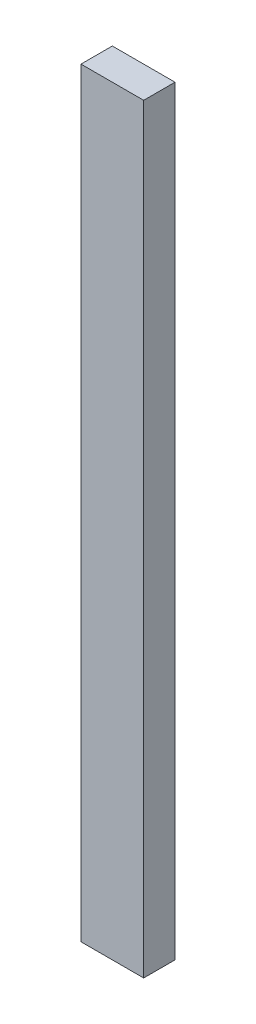
ISO-10303-21;
HEADER;
FILE_DESCRIPTION(('STEP AP214'),'2;1');
FILE_NAME('part.step','',(''),(''),'','','');
FILE_SCHEMA(('AUTOMOTIVE_DESIGN { 1 0 10303 214 1 1 1 1 }'));
ENDSEC;
DATA;
#1=APPLICATION_CONTEXT('core data for automotive mechanical design processes');
#2=APPLICATION_PROTOCOL_DEFINITION('international standard','automotive_design',2000,#1);
#3=PRODUCT_CONTEXT('',#1,'mechanical');
#4=PRODUCT('Part','Part','',(#3));
#5=PRODUCT_RELATED_PRODUCT_CATEGORY('part','',(#4));
#6=PRODUCT_DEFINITION_FORMATION('','',#4);
#7=PRODUCT_DEFINITION_CONTEXT('part definition',#1,'design');
#8=PRODUCT_DEFINITION('design','',#6,#7);
#9=PRODUCT_DEFINITION_SHAPE('','',#8);
#10=(LENGTH_UNIT() NAMED_UNIT(*) SI_UNIT(.MILLI.,.METRE.));
#11=(NAMED_UNIT(*) PLANE_ANGLE_UNIT() SI_UNIT($,.RADIAN.));
#12=(NAMED_UNIT(*) SI_UNIT($,.STERADIAN.) SOLID_ANGLE_UNIT());
#13=UNCERTAINTY_MEASURE_WITH_UNIT(LENGTH_MEASURE(1.E-05),#10,'distance_accuracy_value','');
#14=(GEOMETRIC_REPRESENTATION_CONTEXT(3) GLOBAL_UNCERTAINTY_ASSIGNED_CONTEXT((#13)) GLOBAL_UNIT_ASSIGNED_CONTEXT((#10,
#11,#12)) REPRESENTATION_CONTEXT('',''));
#15=CARTESIAN_POINT('',(0.,0.,0.));
#16=DIRECTION('',(0.,0.,1.));
#17=DIRECTION('',(1.,0.,0.));
#18=AXIS2_PLACEMENT_3D('',#15,#16,#17);
#19=CARTESIAN_POINT('',(24.,-291.,12.));
#20=DIRECTION('',(-1.,0.,0.));
#21=DIRECTION('',(0.,0.,1.));
#22=AXIS2_PLACEMENT_3D('',#19,#20,#21);
#23=PLANE('',#22);
#24=DIRECTION('',(0.,1.,0.));
#25=VECTOR('',#24,1.);
#26=CARTESIAN_POINT('',(24.,-291.,-12.));
#27=LINE('',#26,#25);
#28=CARTESIAN_POINT('',(24.,-291.,-12.));
#29=VERTEX_POINT('',#28);
#30=CARTESIAN_POINT('',(24.,291.,-12.));
#31=VERTEX_POINT('',#30);
#32=EDGE_CURVE('E114',#29,#31,#27,.T.);
#33=ORIENTED_EDGE('',*,*,#32,.T.);
#34=DIRECTION('',(0.,0.,-1.));
#35=VECTOR('',#34,1.);
#36=CARTESIAN_POINT('',(24.,291.,12.));
#37=LINE('',#36,#35);
#38=CARTESIAN_POINT('',(24.,291.,12.));
#39=VERTEX_POINT('',#38);
#40=EDGE_CURVE('E11',#39,#31,#37,.T.);
#41=ORIENTED_EDGE('',*,*,#40,.F.);
#42=DIRECTION('',(0.,1.,0.));
#43=VECTOR('',#42,1.);
#44=CARTESIAN_POINT('',(24.,-291.,12.));
#45=LINE('',#44,#43);
#46=CARTESIAN_POINT('',(24.,-291.,12.));
#47=VERTEX_POINT('',#46);
#48=EDGE_CURVE('E97',#47,#39,#45,.T.);
#49=ORIENTED_EDGE('',*,*,#48,.F.);
#50=DIRECTION('',(0.,0.,-1.));
#51=VECTOR('',#50,1.);
#52=CARTESIAN_POINT('',(24.,-291.,12.));
#53=LINE('',#52,#51);
#54=EDGE_CURVE('E110',#47,#29,#53,.T.);
#55=ORIENTED_EDGE('',*,*,#54,.T.);
#56=EDGE_LOOP('',(#33,#41,#49,#55));
#57=FACE_BOUND('',#56,.T.);
#58=ADVANCED_FACE('F45',(#57),#23,.F.);
#59=CARTESIAN_POINT('',(-24.,291.,12.));
#60=DIRECTION('',(0.,-1.,0.));
#61=DIRECTION('',(0.,0.,-1.));
#62=AXIS2_PLACEMENT_3D('',#59,#60,#61);
#63=PLANE('',#62);
#64=DIRECTION('',(-1.,0.,0.));
#65=VECTOR('',#64,1.);
#66=CARTESIAN_POINT('',(-24.,291.,-12.));
#67=LINE('',#66,#65);
#68=CARTESIAN_POINT('',(-24.,291.,-12.));
#69=VERTEX_POINT('',#68);
#70=EDGE_CURVE('E102',#31,#69,#67,.T.);
#71=ORIENTED_EDGE('',*,*,#70,.T.);
#72=DIRECTION('',(0.,0.,-1.));
#73=VECTOR('',#72,1.);
#74=CARTESIAN_POINT('',(-24.,291.,12.));
#75=LINE('',#74,#73);
#76=CARTESIAN_POINT('',(-24.,291.,12.));
#77=VERTEX_POINT('',#76);
#78=EDGE_CURVE('E54',#77,#69,#75,.T.);
#79=ORIENTED_EDGE('',*,*,#78,.F.);
#80=DIRECTION('',(-1.,0.,0.));
#81=VECTOR('',#80,1.);
#82=CARTESIAN_POINT('',(-24.,291.,12.));
#83=LINE('',#82,#81);
#84=EDGE_CURVE('E92',#39,#77,#83,.T.);
#85=ORIENTED_EDGE('',*,*,#84,.F.);
#86=ORIENTED_EDGE('',*,*,#40,.T.);
#87=EDGE_LOOP('',(#71,#79,#85,#86));
#88=FACE_BOUND('',#87,.T.);
#89=ADVANCED_FACE('F101',(#88),#63,.F.);
#90=CARTESIAN_POINT('',(-24.,-291.,12.));
#91=DIRECTION('',(1.,0.,0.));
#92=DIRECTION('',(0.,0.,-1.));
#93=AXIS2_PLACEMENT_3D('',#90,#91,#92);
#94=PLANE('',#93);
#95=DIRECTION('',(0.,-1.,0.));
#96=VECTOR('',#95,1.);
#97=CARTESIAN_POINT('',(-24.,-291.,-12.));
#98=LINE('',#97,#96);
#99=CARTESIAN_POINT('',(-24.,-291.,-12.));
#100=VERTEX_POINT('',#99);
#101=EDGE_CURVE('E79',#69,#100,#98,.T.);
#102=ORIENTED_EDGE('',*,*,#101,.T.);
#103=DIRECTION('',(0.,0.,-1.));
#104=VECTOR('',#103,1.);
#105=CARTESIAN_POINT('',(-24.,-291.,12.));
#106=LINE('',#105,#104);
#107=CARTESIAN_POINT('',(-24.,-291.,12.));
#108=VERTEX_POINT('',#107);
#109=EDGE_CURVE('E104',#108,#100,#106,.T.);
#110=ORIENTED_EDGE('',*,*,#109,.F.);
#111=DIRECTION('',(0.,-1.,0.));
#112=VECTOR('',#111,1.);
#113=CARTESIAN_POINT('',(-24.,-291.,12.));
#114=LINE('',#113,#112);
#115=EDGE_CURVE('E95',#77,#108,#114,.T.);
#116=ORIENTED_EDGE('',*,*,#115,.F.);
#117=ORIENTED_EDGE('',*,*,#78,.T.);
#118=EDGE_LOOP('',(#102,#110,#116,#117));
#119=FACE_BOUND('',#118,.T.);
#120=ADVANCED_FACE('F105',(#119),#94,.F.);
#121=CARTESIAN_POINT('',(-24.,-291.,12.));
#122=DIRECTION('',(0.,1.,0.));
#123=DIRECTION('',(0.,0.,1.));
#124=AXIS2_PLACEMENT_3D('',#121,#122,#123);
#125=PLANE('',#124);
#126=DIRECTION('',(1.,0.,0.));
#127=VECTOR('',#126,1.);
#128=CARTESIAN_POINT('',(-24.,-291.,-12.));
#129=LINE('',#128,#127);
#130=EDGE_CURVE('E85',#100,#29,#129,.T.);
#131=ORIENTED_EDGE('',*,*,#130,.T.);
#132=ORIENTED_EDGE('',*,*,#54,.F.);
#133=DIRECTION('',(1.,0.,0.));
#134=VECTOR('',#133,1.);
#135=CARTESIAN_POINT('',(-24.,-291.,12.));
#136=LINE('',#135,#134);
#137=EDGE_CURVE('E62',#108,#47,#136,.T.);
#138=ORIENTED_EDGE('',*,*,#137,.F.);
#139=ORIENTED_EDGE('',*,*,#109,.T.);
#140=EDGE_LOOP('',(#131,#132,#138,#139));
#141=FACE_BOUND('',#140,.T.);
#142=ADVANCED_FACE('F128',(#141),#125,.F.);
#143=CARTESIAN_POINT('',(0.,0.,12.));
#144=DIRECTION('',(0.,0.,-1.));
#145=DIRECTION('',(-1.,0.,0.));
#146=AXIS2_PLACEMENT_3D('',#143,#144,#145);
#147=PLANE('',#146);
#148=ORIENTED_EDGE('',*,*,#48,.T.);
#149=ORIENTED_EDGE('',*,*,#84,.T.);
#150=ORIENTED_EDGE('',*,*,#115,.T.);
#151=ORIENTED_EDGE('',*,*,#137,.T.);
#152=EDGE_LOOP('',(#148,#149,#150,#151));
#153=FACE_BOUND('',#152,.T.);
#154=ADVANCED_FACE('F93',(#153),#147,.F.);
#155=CARTESIAN_POINT('',(0.,0.,-12.));
#156=DIRECTION('',(0.,0.,-1.));
#157=DIRECTION('',(-1.,0.,0.));
#158=AXIS2_PLACEMENT_3D('',#155,#156,#157);
#159=PLANE('',#158);
#160=ORIENTED_EDGE('',*,*,#32,.F.);
#161=ORIENTED_EDGE('',*,*,#130,.F.);
#162=ORIENTED_EDGE('',*,*,#101,.F.);
#163=ORIENTED_EDGE('',*,*,#70,.F.);
#164=EDGE_LOOP('',(#160,#161,#162,#163));
#165=FACE_BOUND('',#164,.T.);
#166=ADVANCED_FACE('F131',(#165),#159,.T.);
#167=CLOSED_SHELL('',(#58,#89,#120,#142,#154,#166));
#168=MANIFOLD_SOLID_BREP('B2',#167);
#169=ADVANCED_BREP_SHAPE_REPRESENTATION('',(#18,#168),#14);
#170=SHAPE_DEFINITION_REPRESENTATION(#9,#169);
ENDSEC;
END-ISO-10303-21;
